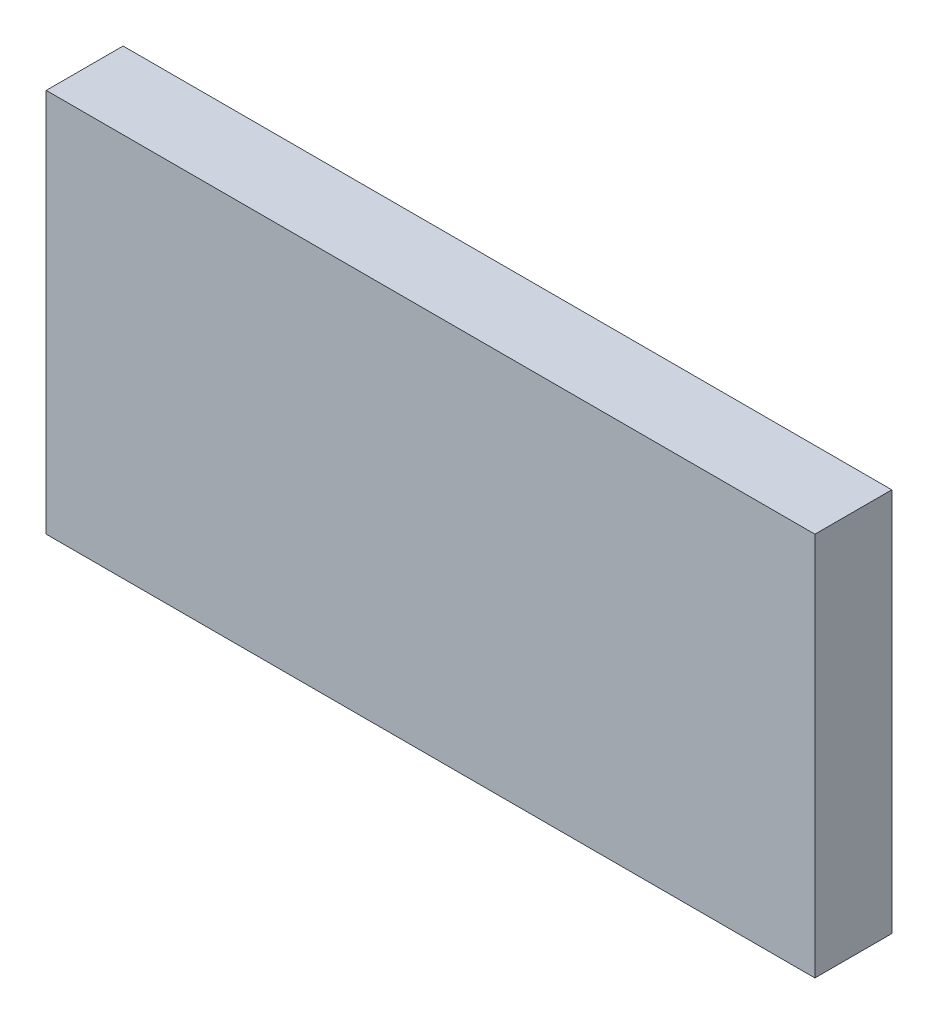
ISO-10303-21;
HEADER;
FILE_DESCRIPTION(('STEP AP214'),'2;1');
FILE_NAME('part.step','',(''),(''),'','','');
FILE_SCHEMA(('AUTOMOTIVE_DESIGN { 1 0 10303 214 1 1 1 1 }'));
ENDSEC;
DATA;
#1=APPLICATION_CONTEXT('core data for automotive mechanical design processes');
#2=APPLICATION_PROTOCOL_DEFINITION('international standard','automotive_design',2000,#1);
#3=PRODUCT_CONTEXT('',#1,'mechanical');
#4=PRODUCT('Part','Part','',(#3));
#5=PRODUCT_RELATED_PRODUCT_CATEGORY('part','',(#4));
#6=PRODUCT_DEFINITION_FORMATION('','',#4);
#7=PRODUCT_DEFINITION_CONTEXT('part definition',#1,'design');
#8=PRODUCT_DEFINITION('design','',#6,#7);
#9=PRODUCT_DEFINITION_SHAPE('','',#8);
#10=(LENGTH_UNIT() NAMED_UNIT(*) SI_UNIT(.MILLI.,.METRE.));
#11=(NAMED_UNIT(*) PLANE_ANGLE_UNIT() SI_UNIT($,.RADIAN.));
#12=(NAMED_UNIT(*) SI_UNIT($,.STERADIAN.) SOLID_ANGLE_UNIT());
#13=UNCERTAINTY_MEASURE_WITH_UNIT(LENGTH_MEASURE(1.E-05),#10,'distance_accuracy_value','');
#14=(GEOMETRIC_REPRESENTATION_CONTEXT(3) GLOBAL_UNCERTAINTY_ASSIGNED_CONTEXT((#13)) GLOBAL_UNIT_ASSIGNED_CONTEXT((#10,
#11,#12)) REPRESENTATION_CONTEXT('',''));
#15=CARTESIAN_POINT('',(0.,0.,0.));
#16=DIRECTION('',(0.,0.,1.));
#17=DIRECTION('',(1.,0.,0.));
#18=AXIS2_PLACEMENT_3D('',#15,#16,#17);
#19=CARTESIAN_POINT('',(0.,0.,-4.));
#20=DIRECTION('',(-1.,0.,0.));
#21=DIRECTION('',(0.,0.,1.));
#22=AXIS2_PLACEMENT_3D('',#19,#20,#21);
#23=PLANE('',#22);
#24=DIRECTION('',(0.,-1.,0.));
#25=VECTOR('',#24,1.);
#26=CARTESIAN_POINT('',(0.,0.,0.));
#27=LINE('',#26,#25);
#28=CARTESIAN_POINT('',(0.,20.,0.));
#29=VERTEX_POINT('',#28);
#30=CARTESIAN_POINT('',(0.,0.,0.));
#31=VERTEX_POINT('',#30);
#32=EDGE_CURVE('E107',#29,#31,#27,.T.);
#33=ORIENTED_EDGE('',*,*,#32,.F.);
#34=DIRECTION('',(0.,0.,1.));
#35=VECTOR('',#34,1.);
#36=CARTESIAN_POINT('',(0.,20.,-4.));
#37=LINE('',#36,#35);
#38=CARTESIAN_POINT('',(0.,20.,-4.));
#39=VERTEX_POINT('',#38);
#40=EDGE_CURVE('E11',#39,#29,#37,.T.);
#41=ORIENTED_EDGE('',*,*,#40,.F.);
#42=DIRECTION('',(0.,-1.,0.));
#43=VECTOR('',#42,1.);
#44=CARTESIAN_POINT('',(0.,0.,-4.));
#45=LINE('',#44,#43);
#46=CARTESIAN_POINT('',(0.,0.,-4.));
#47=VERTEX_POINT('',#46);
#48=EDGE_CURVE('E102',#39,#47,#45,.T.);
#49=ORIENTED_EDGE('',*,*,#48,.T.);
#50=DIRECTION('',(0.,0.,1.));
#51=VECTOR('',#50,1.);
#52=CARTESIAN_POINT('',(0.,0.,-4.));
#53=LINE('',#52,#51);
#54=EDGE_CURVE('E46',#47,#31,#53,.T.);
#55=ORIENTED_EDGE('',*,*,#54,.T.);
#56=EDGE_LOOP('',(#33,#41,#49,#55));
#57=FACE_BOUND('',#56,.T.);
#58=ADVANCED_FACE('F43',(#57),#23,.T.);
#59=CARTESIAN_POINT('',(0.,20.,-4.));
#60=DIRECTION('',(0.,1.,0.));
#61=DIRECTION('',(0.,0.,1.));
#62=AXIS2_PLACEMENT_3D('',#59,#60,#61);
#63=PLANE('',#62);
#64=DIRECTION('',(-1.,0.,0.));
#65=VECTOR('',#64,1.);
#66=CARTESIAN_POINT('',(0.,20.,0.));
#67=LINE('',#66,#65);
#68=CARTESIAN_POINT('',(40.,20.,0.));
#69=VERTEX_POINT('',#68);
#70=EDGE_CURVE('E104',#69,#29,#67,.T.);
#71=ORIENTED_EDGE('',*,*,#70,.F.);
#72=DIRECTION('',(0.,0.,1.));
#73=VECTOR('',#72,1.);
#74=CARTESIAN_POINT('',(40.,20.,-4.));
#75=LINE('',#74,#73);
#76=CARTESIAN_POINT('',(40.,20.,-4.));
#77=VERTEX_POINT('',#76);
#78=EDGE_CURVE('E55',#77,#69,#75,.T.);
#79=ORIENTED_EDGE('',*,*,#78,.F.);
#80=DIRECTION('',(-1.,0.,0.));
#81=VECTOR('',#80,1.);
#82=CARTESIAN_POINT('',(0.,20.,-4.));
#83=LINE('',#82,#81);
#84=EDGE_CURVE('E97',#77,#39,#83,.T.);
#85=ORIENTED_EDGE('',*,*,#84,.T.);
#86=ORIENTED_EDGE('',*,*,#40,.T.);
#87=EDGE_LOOP('',(#71,#79,#85,#86));
#88=FACE_BOUND('',#87,.T.);
#89=ADVANCED_FACE('F117',(#88),#63,.T.);
#90=CARTESIAN_POINT('',(40.,0.,-4.));
#91=DIRECTION('',(1.,0.,0.));
#92=DIRECTION('',(0.,0.,-1.));
#93=AXIS2_PLACEMENT_3D('',#90,#91,#92);
#94=PLANE('',#93);
#95=DIRECTION('',(0.,1.,0.));
#96=VECTOR('',#95,1.);
#97=CARTESIAN_POINT('',(40.,0.,0.));
#98=LINE('',#97,#96);
#99=CARTESIAN_POINT('',(40.,0.,0.));
#100=VERTEX_POINT('',#99);
#101=EDGE_CURVE('E93',#100,#69,#98,.T.);
#102=ORIENTED_EDGE('',*,*,#101,.F.);
#103=DIRECTION('',(0.,0.,1.));
#104=VECTOR('',#103,1.);
#105=CARTESIAN_POINT('',(40.,0.,-4.));
#106=LINE('',#105,#104);
#107=CARTESIAN_POINT('',(40.,0.,-4.));
#108=VERTEX_POINT('',#107);
#109=EDGE_CURVE('E88',#108,#100,#106,.T.);
#110=ORIENTED_EDGE('',*,*,#109,.F.);
#111=DIRECTION('',(0.,1.,0.));
#112=VECTOR('',#111,1.);
#113=CARTESIAN_POINT('',(40.,0.,-4.));
#114=LINE('',#113,#112);
#115=EDGE_CURVE('E91',#108,#77,#114,.T.);
#116=ORIENTED_EDGE('',*,*,#115,.T.);
#117=ORIENTED_EDGE('',*,*,#78,.T.);
#118=EDGE_LOOP('',(#102,#110,#116,#117));
#119=FACE_BOUND('',#118,.T.);
#120=ADVANCED_FACE('F89',(#119),#94,.T.);
#121=CARTESIAN_POINT('',(0.,0.,-4.));
#122=DIRECTION('',(0.,-1.,0.));
#123=DIRECTION('',(0.,0.,-1.));
#124=AXIS2_PLACEMENT_3D('',#121,#122,#123);
#125=PLANE('',#124);
#126=DIRECTION('',(1.,0.,0.));
#127=VECTOR('',#126,1.);
#128=CARTESIAN_POINT('',(0.,0.,0.));
#129=LINE('',#128,#127);
#130=EDGE_CURVE('E110',#31,#100,#129,.T.);
#131=ORIENTED_EDGE('',*,*,#130,.F.);
#132=ORIENTED_EDGE('',*,*,#54,.F.);
#133=DIRECTION('',(1.,0.,0.));
#134=VECTOR('',#133,1.);
#135=CARTESIAN_POINT('',(0.,0.,-4.));
#136=LINE('',#135,#134);
#137=EDGE_CURVE('E100',#47,#108,#136,.T.);
#138=ORIENTED_EDGE('',*,*,#137,.T.);
#139=ORIENTED_EDGE('',*,*,#109,.T.);
#140=EDGE_LOOP('',(#131,#132,#138,#139));
#141=FACE_BOUND('',#140,.T.);
#142=ADVANCED_FACE('F99',(#141),#125,.T.);
#143=CARTESIAN_POINT('',(0.,0.,-4.));
#144=DIRECTION('',(0.,0.,-1.));
#145=DIRECTION('',(-1.,0.,0.));
#146=AXIS2_PLACEMENT_3D('',#143,#144,#145);
#147=PLANE('',#146);
#148=ORIENTED_EDGE('',*,*,#48,.F.);
#149=ORIENTED_EDGE('',*,*,#84,.F.);
#150=ORIENTED_EDGE('',*,*,#115,.F.);
#151=ORIENTED_EDGE('',*,*,#137,.F.);
#152=EDGE_LOOP('',(#148,#149,#150,#151));
#153=FACE_BOUND('',#152,.T.);
#154=ADVANCED_FACE('F96',(#153),#147,.T.);
#155=CARTESIAN_POINT('',(0.,0.,0.));
#156=DIRECTION('',(0.,0.,-1.));
#157=DIRECTION('',(-1.,0.,0.));
#158=AXIS2_PLACEMENT_3D('',#155,#156,#157);
#159=PLANE('',#158);
#160=ORIENTED_EDGE('',*,*,#32,.T.);
#161=ORIENTED_EDGE('',*,*,#130,.T.);
#162=ORIENTED_EDGE('',*,*,#101,.T.);
#163=ORIENTED_EDGE('',*,*,#70,.T.);
#164=EDGE_LOOP('',(#160,#161,#162,#163));
#165=FACE_BOUND('',#164,.T.);
#166=ADVANCED_FACE('F116',(#165),#159,.F.);
#167=CLOSED_SHELL('',(#58,#89,#120,#142,#154,#166));
#168=MANIFOLD_SOLID_BREP('B2',#167);
#169=ADVANCED_BREP_SHAPE_REPRESENTATION('',(#18,#168),#14);
#170=SHAPE_DEFINITION_REPRESENTATION(#9,#169);
ENDSEC;
END-ISO-10303-21;
